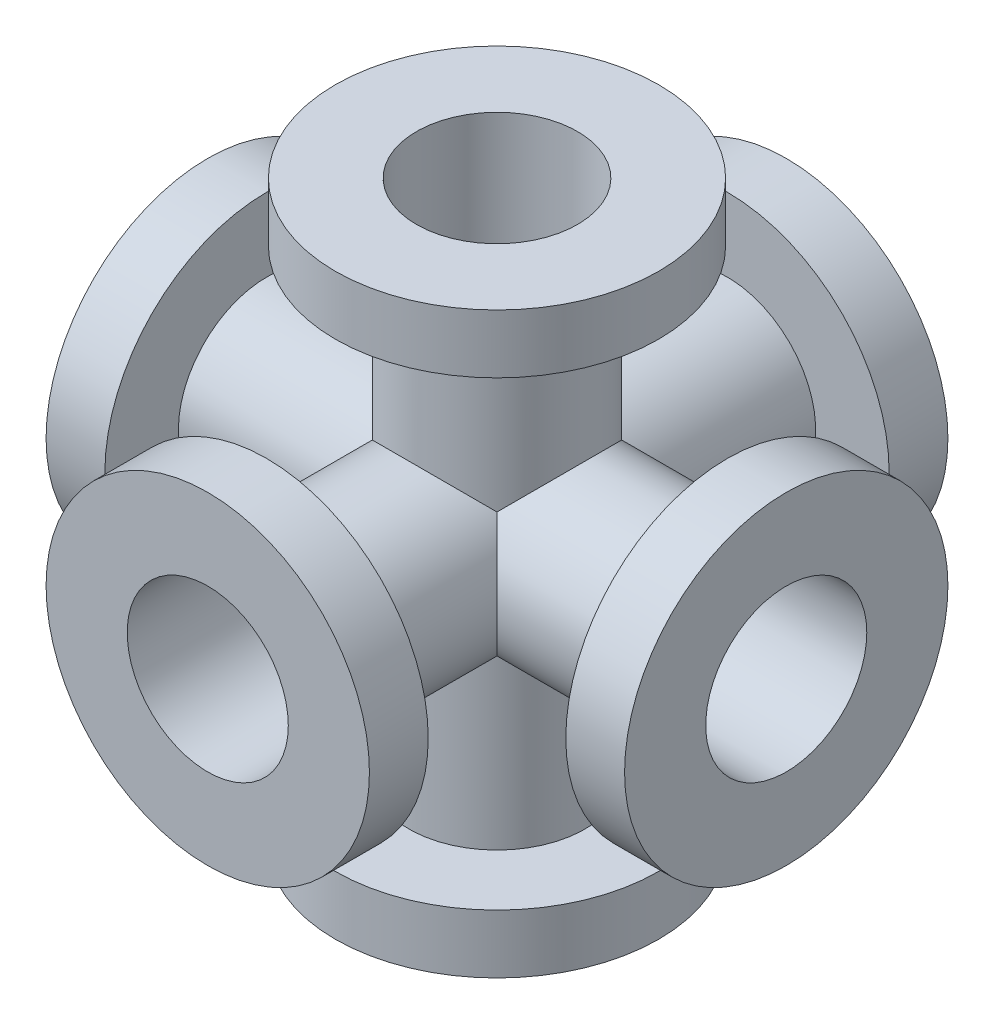
ISO-10303-21;
HEADER;
FILE_DESCRIPTION(('STEP AP214'),'2;1');
FILE_NAME('part.step','',(''),(''),'','','');
FILE_SCHEMA(('AUTOMOTIVE_DESIGN { 1 0 10303 214 1 1 1 1 }'));
ENDSEC;
DATA;
#1=APPLICATION_CONTEXT('core data for automotive mechanical design processes');
#2=APPLICATION_PROTOCOL_DEFINITION('international standard','automotive_design',2000,#1);
#3=PRODUCT_CONTEXT('',#1,'mechanical');
#4=PRODUCT('Part','Part','',(#3));
#5=PRODUCT_RELATED_PRODUCT_CATEGORY('part','',(#4));
#6=PRODUCT_DEFINITION_FORMATION('','',#4);
#7=PRODUCT_DEFINITION_CONTEXT('part definition',#1,'design');
#8=PRODUCT_DEFINITION('design','',#6,#7);
#9=PRODUCT_DEFINITION_SHAPE('','',#8);
#10=(LENGTH_UNIT() NAMED_UNIT(*) SI_UNIT(.MILLI.,.METRE.));
#11=(NAMED_UNIT(*) PLANE_ANGLE_UNIT() SI_UNIT($,.RADIAN.));
#12=(NAMED_UNIT(*) SI_UNIT($,.STERADIAN.) SOLID_ANGLE_UNIT());
#13=UNCERTAINTY_MEASURE_WITH_UNIT(LENGTH_MEASURE(1.E-05),#10,'distance_accuracy_value','');
#14=(GEOMETRIC_REPRESENTATION_CONTEXT(3) GLOBAL_UNCERTAINTY_ASSIGNED_CONTEXT((#13)) GLOBAL_UNIT_ASSIGNED_CONTEXT((#10,
#11,#12)) REPRESENTATION_CONTEXT('',''));
#15=CARTESIAN_POINT('',(0.,0.,0.));
#16=DIRECTION('',(0.,0.,1.));
#17=DIRECTION('',(1.,0.,0.));
#18=AXIS2_PLACEMENT_3D('',#15,#16,#17);
#19=CARTESIAN_POINT('',(0.,-62.484,0.));
#20=DIRECTION('',(0.,1.,0.));
#21=DIRECTION('',(0.,0.,1.));
#22=AXIS2_PLACEMENT_3D('',#19,#20,#21);
#23=CYLINDRICAL_SURFACE('',#22,19.05);
#24=CARTESIAN_POINT('',(0.,0.,0.));
#25=DIRECTION('',(0.707106781186547,0.707106781186547,0.));
#26=DIRECTION('',(-0.707106781186547,0.707106781186547,0.));
#27=AXIS2_PLACEMENT_3D('',#24,#25,#26);
#28=ELLIPSE('',#27,26.9407683632075,19.05);
#29=CARTESIAN_POINT('',(13.4703841816037,-13.4703841816037,13.4703841816037));
#30=VERTEX_POINT('',#29);
#31=CARTESIAN_POINT('',(13.4703841816037,-13.4703841816037,-13.4703841816037));
#32=VERTEX_POINT('',#31);
#33=EDGE_CURVE('E135',#30,#32,#28,.T.);
#34=ORIENTED_EDGE('',*,*,#33,.F.);
#35=CARTESIAN_POINT('',(0.,0.,0.));
#36=DIRECTION('',(0.,0.707106781186547,0.707106781186547));
#37=DIRECTION('',(0.,0.707106781186547,-0.707106781186547));
#38=AXIS2_PLACEMENT_3D('',#35,#36,#37);
#39=ELLIPSE('',#38,26.9407683632075,19.05);
#40=CARTESIAN_POINT('',(-13.4703841816037,-13.4703841816037,13.4703841816037));
#41=VERTEX_POINT('',#40);
#42=EDGE_CURVE('E162',#41,#30,#39,.T.);
#43=ORIENTED_EDGE('',*,*,#42,.F.);
#44=CARTESIAN_POINT('',(0.,0.,0.));
#45=DIRECTION('',(-0.707106781186547,0.707106781186547,0.));
#46=DIRECTION('',(0.707106781186547,0.707106781186547,0.));
#47=AXIS2_PLACEMENT_3D('',#44,#45,#46);
#48=ELLIPSE('',#47,26.9407683632075,19.05);
#49=CARTESIAN_POINT('',(-13.4703841816037,-13.4703841816037,-13.4703841816037));
#50=VERTEX_POINT('',#49);
#51=EDGE_CURVE('E147',#50,#41,#48,.T.);
#52=ORIENTED_EDGE('',*,*,#51,.F.);
#53=CARTESIAN_POINT('',(0.,0.,0.));
#54=DIRECTION('',(0.,0.707106781186547,-0.707106781186547));
#55=DIRECTION('',(0.,0.707106781186547,0.707106781186547));
#56=AXIS2_PLACEMENT_3D('',#53,#54,#55);
#57=ELLIPSE('',#56,26.9407683632075,19.05);
#58=EDGE_CURVE('E159',#32,#50,#57,.T.);
#59=ORIENTED_EDGE('',*,*,#58,.F.);
#60=EDGE_LOOP('',(#34,#43,#52,#59));
#61=FACE_BOUND('',#60,.T.);
#62=CARTESIAN_POINT('',(0.,-49.784,0.));
#63=DIRECTION('',(0.,-1.,0.));
#64=DIRECTION('',(0.,0.,-1.));
#65=AXIS2_PLACEMENT_3D('',#62,#63,#64);
#66=CIRCLE('',#65,19.05);
#67=CARTESIAN_POINT('',(0.,-49.784,-19.05));
#68=VERTEX_POINT('',#67);
#69=EDGE_CURVE('E207',#68,#68,#66,.F.);
#70=ORIENTED_EDGE('',*,*,#69,.T.);
#71=EDGE_LOOP('',(#70));
#72=FACE_BOUND('',#71,.T.);
#73=ADVANCED_FACE('F31',(#61,#72),#23,.T.);
#74=CARTESIAN_POINT('',(0.,0.,0.));
#75=DIRECTION('',(0.707106781186547,0.707106781186547,0.));
#76=DIRECTION('',(-0.707106781186547,0.707106781186547,0.));
#77=AXIS2_PLACEMENT_3D('',#74,#75,#76);
#78=ELLIPSE('',#77,26.9407683632075,19.05);
#79=CARTESIAN_POINT('',(-13.4703841816037,13.4703841816037,13.4703841816037));
#80=VERTEX_POINT('',#79);
#81=CARTESIAN_POINT('',(-13.4703841816037,13.4703841816037,-13.4703841816037));
#82=VERTEX_POINT('',#81);
#83=EDGE_CURVE('E138',#80,#82,#78,.F.);
#84=ORIENTED_EDGE('',*,*,#83,.F.);
#85=CARTESIAN_POINT('',(0.,0.,0.));
#86=DIRECTION('',(0.,0.707106781186547,-0.707106781186547));
#87=DIRECTION('',(0.,0.707106781186547,0.707106781186547));
#88=AXIS2_PLACEMENT_3D('',#85,#86,#87);
#89=ELLIPSE('',#88,26.9407683632075,19.05);
#90=CARTESIAN_POINT('',(13.4703841816037,13.4703841816037,13.4703841816037));
#91=VERTEX_POINT('',#90);
#92=EDGE_CURVE('E156',#91,#80,#89,.F.);
#93=ORIENTED_EDGE('',*,*,#92,.F.);
#94=CARTESIAN_POINT('',(0.,0.,0.));
#95=DIRECTION('',(-0.707106781186547,0.707106781186547,0.));
#96=DIRECTION('',(0.707106781186547,0.707106781186547,0.));
#97=AXIS2_PLACEMENT_3D('',#94,#95,#96);
#98=ELLIPSE('',#97,26.9407683632075,19.05);
#99=CARTESIAN_POINT('',(13.4703841816037,13.4703841816037,-13.4703841816037));
#100=VERTEX_POINT('',#99);
#101=EDGE_CURVE('E126',#100,#91,#98,.F.);
#102=ORIENTED_EDGE('',*,*,#101,.F.);
#103=CARTESIAN_POINT('',(0.,0.,0.));
#104=DIRECTION('',(0.,0.707106781186547,0.707106781186547));
#105=DIRECTION('',(0.,0.707106781186547,-0.707106781186547));
#106=AXIS2_PLACEMENT_3D('',#103,#104,#105);
#107=ELLIPSE('',#106,26.9407683632075,19.05);
#108=EDGE_CURVE('E165',#82,#100,#107,.F.);
#109=ORIENTED_EDGE('',*,*,#108,.F.);
#110=EDGE_LOOP('',(#84,#93,#102,#109));
#111=FACE_BOUND('',#110,.T.);
#112=CARTESIAN_POINT('',(0.,49.784,0.));
#113=DIRECTION('',(0.,1.,0.));
#114=DIRECTION('',(0.,0.,1.));
#115=AXIS2_PLACEMENT_3D('',#112,#113,#114);
#116=CIRCLE('',#115,19.05);
#117=CARTESIAN_POINT('',(0.,49.784,19.05));
#118=VERTEX_POINT('',#117);
#119=EDGE_CURVE('E221',#118,#118,#116,.F.);
#120=ORIENTED_EDGE('',*,*,#119,.T.);
#121=EDGE_LOOP('',(#120));
#122=FACE_BOUND('',#121,.T.);
#123=ADVANCED_FACE('F195',(#111,#122),#23,.T.);
#124=CARTESIAN_POINT('',(0.,0.,-62.484));
#125=DIRECTION('',(0.,0.,1.));
#126=DIRECTION('',(1.,0.,0.));
#127=AXIS2_PLACEMENT_3D('',#124,#125,#126);
#128=CYLINDRICAL_SURFACE('',#127,19.05);
#129=CARTESIAN_POINT('',(0.,0.,0.));
#130=DIRECTION('',(0.707106781186547,0.,0.707106781186547));
#131=DIRECTION('',(-0.707106781186547,0.,0.707106781186547));
#132=AXIS2_PLACEMENT_3D('',#129,#130,#131);
#133=ELLIPSE('',#132,26.9407683632075,19.05);
#134=EDGE_CURVE('E141',#41,#80,#133,.F.);
#135=ORIENTED_EDGE('',*,*,#134,.F.);
#136=ORIENTED_EDGE('',*,*,#42,.T.);
#137=CARTESIAN_POINT('',(0.,0.,0.));
#138=DIRECTION('',(-0.707106781186547,0.,0.707106781186547));
#139=DIRECTION('',(0.707106781186547,0.,0.707106781186547));
#140=AXIS2_PLACEMENT_3D('',#137,#138,#139);
#141=ELLIPSE('',#140,26.9407683632075,19.05);
#142=EDGE_CURVE('E129',#91,#30,#141,.F.);
#143=ORIENTED_EDGE('',*,*,#142,.F.);
#144=ORIENTED_EDGE('',*,*,#92,.T.);
#145=EDGE_LOOP('',(#135,#136,#143,#144));
#146=FACE_BOUND('',#145,.T.);
#147=CARTESIAN_POINT('',(0.,0.,49.784));
#148=DIRECTION('',(0.,0.,1.));
#149=DIRECTION('',(1.,0.,0.));
#150=AXIS2_PLACEMENT_3D('',#147,#148,#149);
#151=CIRCLE('',#150,19.05);
#152=CARTESIAN_POINT('',(19.05,0.,49.784));
#153=VERTEX_POINT('',#152);
#154=EDGE_CURVE('E229',#153,#153,#151,.F.);
#155=ORIENTED_EDGE('',*,*,#154,.T.);
#156=EDGE_LOOP('',(#155));
#157=FACE_BOUND('',#156,.T.);
#158=ADVANCED_FACE('F200',(#146,#157),#128,.T.);
#159=CARTESIAN_POINT('',(0.,0.,0.));
#160=DIRECTION('',(0.707106781186547,0.,0.707106781186547));
#161=DIRECTION('',(-0.707106781186547,0.,0.707106781186547));
#162=AXIS2_PLACEMENT_3D('',#159,#160,#161);
#163=ELLIPSE('',#162,26.9407683632075,19.05);
#164=EDGE_CURVE('E132',#32,#100,#163,.T.);
#165=ORIENTED_EDGE('',*,*,#164,.F.);
#166=ORIENTED_EDGE('',*,*,#58,.T.);
#167=CARTESIAN_POINT('',(0.,0.,0.));
#168=DIRECTION('',(-0.707106781186547,0.,0.707106781186547));
#169=DIRECTION('',(0.707106781186547,0.,0.707106781186547));
#170=AXIS2_PLACEMENT_3D('',#167,#168,#169);
#171=ELLIPSE('',#170,26.9407683632075,19.05);
#172=EDGE_CURVE('E144',#82,#50,#171,.T.);
#173=ORIENTED_EDGE('',*,*,#172,.F.);
#174=ORIENTED_EDGE('',*,*,#108,.T.);
#175=EDGE_LOOP('',(#165,#166,#173,#174));
#176=FACE_BOUND('',#175,.T.);
#177=CARTESIAN_POINT('',(0.,0.,-49.784));
#178=DIRECTION('',(0.,0.,-1.));
#179=DIRECTION('',(-1.,0.,0.));
#180=AXIS2_PLACEMENT_3D('',#177,#178,#179);
#181=CIRCLE('',#180,19.05);
#182=CARTESIAN_POINT('',(-19.05,0.,-49.784));
#183=VERTEX_POINT('',#182);
#184=EDGE_CURVE('E238',#183,#183,#181,.F.);
#185=ORIENTED_EDGE('',*,*,#184,.T.);
#186=EDGE_LOOP('',(#185));
#187=FACE_BOUND('',#186,.T.);
#188=ADVANCED_FACE('F328',(#176,#187),#128,.T.);
#189=CARTESIAN_POINT('',(-62.484,0.,0.));
#190=DIRECTION('',(1.,0.,0.));
#191=DIRECTION('',(0.,0.,-1.));
#192=AXIS2_PLACEMENT_3D('',#189,#190,#191);
#193=CYLINDRICAL_SURFACE('',#192,19.05);
#194=ORIENTED_EDGE('',*,*,#172,.T.);
#195=ORIENTED_EDGE('',*,*,#51,.T.);
#196=ORIENTED_EDGE('',*,*,#134,.T.);
#197=ORIENTED_EDGE('',*,*,#83,.T.);
#198=EDGE_LOOP('',(#194,#195,#196,#197));
#199=FACE_BOUND('',#198,.T.);
#200=CARTESIAN_POINT('',(-49.784,0.,0.));
#201=DIRECTION('',(-1.,0.,0.));
#202=DIRECTION('',(0.,0.,1.));
#203=AXIS2_PLACEMENT_3D('',#200,#201,#202);
#204=CIRCLE('',#203,19.05);
#205=CARTESIAN_POINT('',(-49.784,0.,19.05));
#206=VERTEX_POINT('',#205);
#207=EDGE_CURVE('E247',#206,#206,#204,.F.);
#208=ORIENTED_EDGE('',*,*,#207,.T.);
#209=EDGE_LOOP('',(#208));
#210=FACE_BOUND('',#209,.T.);
#211=ADVANCED_FACE('F325',(#199,#210),#193,.T.);
#212=ORIENTED_EDGE('',*,*,#142,.T.);
#213=ORIENTED_EDGE('',*,*,#33,.T.);
#214=ORIENTED_EDGE('',*,*,#164,.T.);
#215=ORIENTED_EDGE('',*,*,#101,.T.);
#216=EDGE_LOOP('',(#212,#213,#214,#215));
#217=FACE_BOUND('',#216,.T.);
#218=CARTESIAN_POINT('',(49.784,0.,0.));
#219=DIRECTION('',(1.,0.,0.));
#220=DIRECTION('',(0.,0.,-1.));
#221=AXIS2_PLACEMENT_3D('',#218,#219,#220);
#222=CIRCLE('',#221,19.05);
#223=CARTESIAN_POINT('',(49.784,0.,-19.05));
#224=VERTEX_POINT('',#223);
#225=EDGE_CURVE('E34',#224,#224,#222,.F.);
#226=ORIENTED_EDGE('',*,*,#225,.T.);
#227=EDGE_LOOP('',(#226));
#228=FACE_BOUND('',#227,.T.);
#229=ADVANCED_FACE('F327',(#217,#228),#193,.T.);
#230=CARTESIAN_POINT('',(-62.484,0.,0.));
#231=DIRECTION('',(1.,0.,0.));
#232=DIRECTION('',(0.,0.,-1.));
#233=AXIS2_PLACEMENT_3D('',#230,#231,#232);
#234=CYLINDRICAL_SURFACE('',#233,17.399);
#235=CARTESIAN_POINT('',(62.484,0.,0.));
#236=DIRECTION('',(1.,0.,0.));
#237=DIRECTION('',(0.,0.,-1.));
#238=AXIS2_PLACEMENT_3D('',#235,#236,#237);
#239=CIRCLE('',#238,17.399);
#240=CARTESIAN_POINT('',(62.484,0.,-17.399));
#241=VERTEX_POINT('',#240);
#242=EDGE_CURVE('E115',#241,#241,#239,.T.);
#243=ORIENTED_EDGE('',*,*,#242,.T.);
#244=EDGE_LOOP('',(#243));
#245=FACE_BOUND('',#244,.T.);
#246=CARTESIAN_POINT('',(0.,0.,0.));
#247=DIRECTION('',(0.707106781186547,0.,0.707106781186547));
#248=DIRECTION('',(0.707106781186547,0.,-0.707106781186547));
#249=AXIS2_PLACEMENT_3D('',#246,#247,#248);
#250=ELLIPSE('',#249,24.6059017717295,17.399);
#251=CARTESIAN_POINT('',(12.3029508858647,12.3029508858647,-12.3029508858647));
#252=VERTEX_POINT('',#251);
#253=CARTESIAN_POINT('',(12.3029508858647,-12.3029508858647,-12.3029508858647));
#254=VERTEX_POINT('',#253);
#255=EDGE_CURVE('E117',#252,#254,#250,.F.);
#256=ORIENTED_EDGE('',*,*,#255,.T.);
#257=CARTESIAN_POINT('',(0.,0.,0.));
#258=DIRECTION('',(0.707106781186547,0.707106781186547,0.));
#259=DIRECTION('',(0.707106781186547,-0.707106781186547,0.));
#260=AXIS2_PLACEMENT_3D('',#257,#258,#259);
#261=ELLIPSE('',#260,24.6059017717295,17.399);
#262=CARTESIAN_POINT('',(12.3029508858647,-12.3029508858647,12.3029508858647));
#263=VERTEX_POINT('',#262);
#264=EDGE_CURVE('E53',#254,#263,#261,.F.);
#265=ORIENTED_EDGE('',*,*,#264,.T.);
#266=CARTESIAN_POINT('',(0.,0.,0.));
#267=DIRECTION('',(0.707106781186547,0.,-0.707106781186547));
#268=DIRECTION('',(0.707106781186547,0.,0.707106781186547));
#269=AXIS2_PLACEMENT_3D('',#266,#267,#268);
#270=ELLIPSE('',#269,24.6059017717295,17.399);
#271=CARTESIAN_POINT('',(12.3029508858647,12.3029508858647,12.3029508858647));
#272=VERTEX_POINT('',#271);
#273=EDGE_CURVE('E112',#263,#272,#270,.F.);
#274=ORIENTED_EDGE('',*,*,#273,.T.);
#275=CARTESIAN_POINT('',(0.,0.,0.));
#276=DIRECTION('',(0.707106781186547,-0.707106781186547,0.));
#277=DIRECTION('',(0.707106781186547,0.707106781186547,0.));
#278=AXIS2_PLACEMENT_3D('',#275,#276,#277);
#279=ELLIPSE('',#278,24.6059017717295,17.399);
#280=EDGE_CURVE('E264',#272,#252,#279,.F.);
#281=ORIENTED_EDGE('',*,*,#280,.T.);
#282=EDGE_LOOP('',(#256,#265,#274,#281));
#283=FACE_BOUND('',#282,.T.);
#284=ADVANCED_FACE('F188',(#245,#283),#234,.F.);
#285=CARTESIAN_POINT('',(0.,-62.484,0.));
#286=DIRECTION('',(0.,1.,0.));
#287=DIRECTION('',(0.,0.,1.));
#288=AXIS2_PLACEMENT_3D('',#285,#286,#287);
#289=PLANE('',#288);
#290=CARTESIAN_POINT('',(0.,-62.484,0.));
#291=DIRECTION('',(0.,1.,0.));
#292=DIRECTION('',(0.,0.,1.));
#293=AXIS2_PLACEMENT_3D('',#290,#291,#292);
#294=CIRCLE('',#293,17.399);
#295=CARTESIAN_POINT('',(0.,-62.484,17.399));
#296=VERTEX_POINT('',#295);
#297=EDGE_CURVE('E100',#296,#296,#294,.T.);
#298=ORIENTED_EDGE('',*,*,#297,.T.);
#299=EDGE_LOOP('',(#298));
#300=FACE_BOUND('',#299,.T.);
#301=CARTESIAN_POINT('',(0.,-62.484,0.));
#302=DIRECTION('',(0.,1.,0.));
#303=DIRECTION('',(0.,0.,1.));
#304=AXIS2_PLACEMENT_3D('',#301,#302,#303);
#305=CIRCLE('',#304,34.925);
#306=CARTESIAN_POINT('',(0.,-62.484,34.925));
#307=VERTEX_POINT('',#306);
#308=EDGE_CURVE('E216',#307,#307,#305,.T.);
#309=ORIENTED_EDGE('',*,*,#308,.F.);
#310=EDGE_LOOP('',(#309));
#311=FACE_BOUND('',#310,.T.);
#312=ADVANCED_FACE('F174',(#300,#311),#289,.F.);
#313=CARTESIAN_POINT('',(0.,-62.484,0.));
#314=DIRECTION('',(0.,1.,0.));
#315=DIRECTION('',(0.,0.,1.));
#316=AXIS2_PLACEMENT_3D('',#313,#314,#315);
#317=CYLINDRICAL_SURFACE('',#316,17.399);
#318=ORIENTED_EDGE('',*,*,#297,.F.);
#319=EDGE_LOOP('',(#318));
#320=FACE_BOUND('',#319,.T.);
#321=CARTESIAN_POINT('',(0.,0.,0.));
#322=DIRECTION('',(0.,-0.707106781186547,0.707106781186547));
#323=DIRECTION('',(0.,0.707106781186547,0.707106781186547));
#324=AXIS2_PLACEMENT_3D('',#321,#322,#323);
#325=ELLIPSE('',#324,24.6059017717295,17.399);
#326=CARTESIAN_POINT('',(-12.3029508858647,-12.3029508858647,-12.3029508858647));
#327=VERTEX_POINT('',#326);
#328=EDGE_CURVE('E39',#327,#254,#325,.T.);
#329=ORIENTED_EDGE('',*,*,#328,.F.);
#330=CARTESIAN_POINT('',(0.,0.,0.));
#331=DIRECTION('',(0.707106781186547,-0.707106781186547,0.));
#332=DIRECTION('',(0.707106781186547,0.707106781186547,0.));
#333=AXIS2_PLACEMENT_3D('',#330,#331,#332);
#334=ELLIPSE('',#333,24.6059017717295,17.399);
#335=CARTESIAN_POINT('',(-12.3029508858647,-12.3029508858647,12.3029508858647));
#336=VERTEX_POINT('',#335);
#337=EDGE_CURVE('E94',#336,#327,#334,.T.);
#338=ORIENTED_EDGE('',*,*,#337,.F.);
#339=CARTESIAN_POINT('',(0.,0.,0.));
#340=DIRECTION('',(0.,0.707106781186547,0.707106781186547));
#341=DIRECTION('',(0.,-0.707106781186547,0.707106781186547));
#342=AXIS2_PLACEMENT_3D('',#339,#340,#341);
#343=ELLIPSE('',#342,24.6059017717295,17.399);
#344=EDGE_CURVE('E109',#263,#336,#343,.F.);
#345=ORIENTED_EDGE('',*,*,#344,.F.);
#346=ORIENTED_EDGE('',*,*,#264,.F.);
#347=EDGE_LOOP('',(#329,#338,#345,#346));
#348=FACE_BOUND('',#347,.T.);
#349=ADVANCED_FACE('F93',(#320,#348),#317,.F.);
#350=CARTESIAN_POINT('',(0.,0.,-62.484));
#351=DIRECTION('',(0.,0.,1.));
#352=DIRECTION('',(1.,0.,0.));
#353=AXIS2_PLACEMENT_3D('',#350,#351,#352);
#354=PLANE('',#353);
#355=CARTESIAN_POINT('',(0.,0.,-62.484));
#356=DIRECTION('',(0.,0.,1.));
#357=DIRECTION('',(1.,0.,0.));
#358=AXIS2_PLACEMENT_3D('',#355,#356,#357);
#359=CIRCLE('',#358,17.399);
#360=CARTESIAN_POINT('',(17.399,0.,-62.484));
#361=VERTEX_POINT('',#360);
#362=EDGE_CURVE('E153',#361,#361,#359,.T.);
#363=ORIENTED_EDGE('',*,*,#362,.T.);
#364=EDGE_LOOP('',(#363));
#365=FACE_BOUND('',#364,.T.);
#366=CARTESIAN_POINT('',(0.,0.,-62.484));
#367=DIRECTION('',(0.,0.,-1.));
#368=DIRECTION('',(-1.,0.,0.));
#369=AXIS2_PLACEMENT_3D('',#366,#367,#368);
#370=CIRCLE('',#369,34.925);
#371=CARTESIAN_POINT('',(-34.925,0.,-62.484));
#372=VERTEX_POINT('',#371);
#373=EDGE_CURVE('E234',#372,#372,#370,.T.);
#374=ORIENTED_EDGE('',*,*,#373,.T.);
#375=EDGE_LOOP('',(#374));
#376=FACE_BOUND('',#375,.T.);
#377=ADVANCED_FACE('F178',(#365,#376),#354,.F.);
#378=CARTESIAN_POINT('',(0.,0.,-62.484));
#379=DIRECTION('',(0.,0.,1.));
#380=DIRECTION('',(1.,0.,0.));
#381=AXIS2_PLACEMENT_3D('',#378,#379,#380);
#382=CYLINDRICAL_SURFACE('',#381,17.399);
#383=CARTESIAN_POINT('',(0.,0.,62.484));
#384=DIRECTION('',(0.,0.,1.));
#385=DIRECTION('',(1.,0.,0.));
#386=AXIS2_PLACEMENT_3D('',#383,#384,#385);
#387=CIRCLE('',#386,17.399);
#388=CARTESIAN_POINT('',(17.399,0.,62.484));
#389=VERTEX_POINT('',#388);
#390=EDGE_CURVE('E150',#389,#389,#387,.T.);
#391=ORIENTED_EDGE('',*,*,#390,.T.);
#392=EDGE_LOOP('',(#391));
#393=FACE_BOUND('',#392,.T.);
#394=ORIENTED_EDGE('',*,*,#273,.F.);
#395=ORIENTED_EDGE('',*,*,#344,.T.);
#396=CARTESIAN_POINT('',(0.,0.,0.));
#397=DIRECTION('',(0.707106781186547,0.,0.707106781186547));
#398=DIRECTION('',(0.707106781186547,0.,-0.707106781186547));
#399=AXIS2_PLACEMENT_3D('',#396,#397,#398);
#400=ELLIPSE('',#399,24.6059017717295,17.399);
#401=CARTESIAN_POINT('',(-12.3029508858647,12.3029508858647,12.3029508858647));
#402=VERTEX_POINT('',#401);
#403=EDGE_CURVE('E108',#402,#336,#400,.T.);
#404=ORIENTED_EDGE('',*,*,#403,.F.);
#405=CARTESIAN_POINT('',(0.,0.,0.));
#406=DIRECTION('',(0.,-0.707106781186547,0.707106781186547));
#407=DIRECTION('',(0.,0.707106781186547,0.707106781186547));
#408=AXIS2_PLACEMENT_3D('',#405,#406,#407);
#409=ELLIPSE('',#408,24.6059017717295,17.399);
#410=EDGE_CURVE('E261',#402,#272,#409,.F.);
#411=ORIENTED_EDGE('',*,*,#410,.T.);
#412=EDGE_LOOP('',(#394,#395,#404,#411));
#413=FACE_BOUND('',#412,.T.);
#414=ADVANCED_FACE('F185',(#393,#413),#382,.F.);
#415=CARTESIAN_POINT('',(0.,0.,62.484));
#416=DIRECTION('',(0.,0.,1.));
#417=DIRECTION('',(1.,0.,0.));
#418=AXIS2_PLACEMENT_3D('',#415,#416,#417);
#419=PLANE('',#418);
#420=ORIENTED_EDGE('',*,*,#390,.F.);
#421=EDGE_LOOP('',(#420));
#422=FACE_BOUND('',#421,.T.);
#423=CARTESIAN_POINT('',(0.,0.,62.484));
#424=DIRECTION('',(0.,0.,-1.));
#425=DIRECTION('',(-1.,0.,0.));
#426=AXIS2_PLACEMENT_3D('',#423,#424,#425);
#427=CIRCLE('',#426,34.925);
#428=CARTESIAN_POINT('',(-34.925,0.,62.484));
#429=VERTEX_POINT('',#428);
#430=EDGE_CURVE('E225',#429,#429,#427,.T.);
#431=ORIENTED_EDGE('',*,*,#430,.F.);
#432=EDGE_LOOP('',(#431));
#433=FACE_BOUND('',#432,.T.);
#434=ADVANCED_FACE('F270',(#422,#433),#419,.T.);
#435=CARTESIAN_POINT('',(0.,62.484,0.));
#436=DIRECTION('',(0.,1.,0.));
#437=DIRECTION('',(0.,0.,1.));
#438=AXIS2_PLACEMENT_3D('',#435,#436,#437);
#439=PLANE('',#438);
#440=CARTESIAN_POINT('',(0.,62.484,0.));
#441=DIRECTION('',(0.,1.,0.));
#442=DIRECTION('',(0.,0.,1.));
#443=AXIS2_PLACEMENT_3D('',#440,#441,#442);
#444=CIRCLE('',#443,17.399);
#445=CARTESIAN_POINT('',(0.,62.484,17.399));
#446=VERTEX_POINT('',#445);
#447=EDGE_CURVE('E168',#446,#446,#444,.T.);
#448=ORIENTED_EDGE('',*,*,#447,.F.);
#449=EDGE_LOOP('',(#448));
#450=FACE_BOUND('',#449,.T.);
#451=CARTESIAN_POINT('',(0.,62.484,0.));
#452=DIRECTION('',(0.,1.,0.));
#453=DIRECTION('',(0.,0.,1.));
#454=AXIS2_PLACEMENT_3D('',#451,#452,#453);
#455=CIRCLE('',#454,34.925);
#456=CARTESIAN_POINT('',(0.,62.484,34.925));
#457=VERTEX_POINT('',#456);
#458=EDGE_CURVE('E209',#457,#457,#455,.T.);
#459=ORIENTED_EDGE('',*,*,#458,.T.);
#460=EDGE_LOOP('',(#459));
#461=FACE_BOUND('',#460,.T.);
#462=ADVANCED_FACE('F192',(#450,#461),#439,.T.);
#463=ORIENTED_EDGE('',*,*,#447,.T.);
#464=EDGE_LOOP('',(#463));
#465=FACE_BOUND('',#464,.T.);
#466=ORIENTED_EDGE('',*,*,#410,.F.);
#467=CARTESIAN_POINT('',(0.,0.,0.));
#468=DIRECTION('',(0.707106781186547,0.707106781186547,0.));
#469=DIRECTION('',(0.707106781186547,-0.707106781186547,0.));
#470=AXIS2_PLACEMENT_3D('',#467,#468,#469);
#471=ELLIPSE('',#470,24.6059017717295,17.399);
#472=CARTESIAN_POINT('',(-12.3029508858647,12.3029508858647,-12.3029508858647));
#473=VERTEX_POINT('',#472);
#474=EDGE_CURVE('E46',#473,#402,#471,.T.);
#475=ORIENTED_EDGE('',*,*,#474,.F.);
#476=CARTESIAN_POINT('',(0.,0.,0.));
#477=DIRECTION('',(0.,0.707106781186547,0.707106781186547));
#478=DIRECTION('',(0.,-0.707106781186547,0.707106781186547));
#479=AXIS2_PLACEMENT_3D('',#476,#477,#478);
#480=ELLIPSE('',#479,24.6059017717295,17.399);
#481=EDGE_CURVE('E11',#252,#473,#480,.T.);
#482=ORIENTED_EDGE('',*,*,#481,.F.);
#483=ORIENTED_EDGE('',*,*,#280,.F.);
#484=EDGE_LOOP('',(#466,#475,#482,#483));
#485=FACE_BOUND('',#484,.T.);
#486=ADVANCED_FACE('F180',(#465,#485),#317,.F.);
#487=CARTESIAN_POINT('',(62.484,0.,0.));
#488=DIRECTION('',(1.,0.,0.));
#489=DIRECTION('',(0.,0.,-1.));
#490=AXIS2_PLACEMENT_3D('',#487,#488,#489);
#491=PLANE('',#490);
#492=ORIENTED_EDGE('',*,*,#242,.F.);
#493=EDGE_LOOP('',(#492));
#494=FACE_BOUND('',#493,.T.);
#495=CARTESIAN_POINT('',(62.484,0.,0.));
#496=DIRECTION('',(1.,0.,0.));
#497=DIRECTION('',(0.,0.,-1.));
#498=AXIS2_PLACEMENT_3D('',#495,#496,#497);
#499=CIRCLE('',#498,34.925);
#500=CARTESIAN_POINT('',(62.484,0.,-34.925));
#501=VERTEX_POINT('',#500);
#502=EDGE_CURVE('E252',#501,#501,#499,.T.);
#503=ORIENTED_EDGE('',*,*,#502,.T.);
#504=EDGE_LOOP('',(#503));
#505=FACE_BOUND('',#504,.T.);
#506=ADVANCED_FACE('F191',(#494,#505),#491,.T.);
#507=CARTESIAN_POINT('',(-62.484,0.,0.));
#508=DIRECTION('',(1.,0.,0.));
#509=DIRECTION('',(0.,0.,-1.));
#510=AXIS2_PLACEMENT_3D('',#507,#508,#509);
#511=PLANE('',#510);
#512=CARTESIAN_POINT('',(-62.484,0.,0.));
#513=DIRECTION('',(1.,0.,0.));
#514=DIRECTION('',(0.,0.,-1.));
#515=AXIS2_PLACEMENT_3D('',#512,#513,#514);
#516=CIRCLE('',#515,17.399);
#517=CARTESIAN_POINT('',(-62.484,0.,-17.399));
#518=VERTEX_POINT('',#517);
#519=EDGE_CURVE('E123',#518,#518,#516,.T.);
#520=ORIENTED_EDGE('',*,*,#519,.T.);
#521=EDGE_LOOP('',(#520));
#522=FACE_BOUND('',#521,.T.);
#523=CARTESIAN_POINT('',(-62.484,0.,0.));
#524=DIRECTION('',(1.,0.,0.));
#525=DIRECTION('',(0.,0.,-1.));
#526=AXIS2_PLACEMENT_3D('',#523,#524,#525);
#527=CIRCLE('',#526,34.925);
#528=CARTESIAN_POINT('',(-62.484,0.,-34.925));
#529=VERTEX_POINT('',#528);
#530=EDGE_CURVE('E243',#529,#529,#527,.T.);
#531=ORIENTED_EDGE('',*,*,#530,.F.);
#532=EDGE_LOOP('',(#531));
#533=FACE_BOUND('',#532,.T.);
#534=ADVANCED_FACE('F288',(#522,#533),#511,.F.);
#535=ORIENTED_EDGE('',*,*,#519,.F.);
#536=EDGE_LOOP('',(#535));
#537=FACE_BOUND('',#536,.T.);
#538=CARTESIAN_POINT('',(0.,0.,0.));
#539=DIRECTION('',(0.707106781186547,0.,-0.707106781186547));
#540=DIRECTION('',(0.707106781186547,0.,0.707106781186547));
#541=AXIS2_PLACEMENT_3D('',#538,#539,#540);
#542=ELLIPSE('',#541,24.6059017717295,17.399);
#543=EDGE_CURVE('E106',#327,#473,#542,.T.);
#544=ORIENTED_EDGE('',*,*,#543,.T.);
#545=ORIENTED_EDGE('',*,*,#474,.T.);
#546=ORIENTED_EDGE('',*,*,#403,.T.);
#547=ORIENTED_EDGE('',*,*,#337,.T.);
#548=EDGE_LOOP('',(#544,#545,#546,#547));
#549=FACE_BOUND('',#548,.T.);
#550=ADVANCED_FACE('F105',(#537,#549),#234,.F.);
#551=ORIENTED_EDGE('',*,*,#362,.F.);
#552=EDGE_LOOP('',(#551));
#553=FACE_BOUND('',#552,.T.);
#554=ORIENTED_EDGE('',*,*,#255,.F.);
#555=ORIENTED_EDGE('',*,*,#481,.T.);
#556=ORIENTED_EDGE('',*,*,#543,.F.);
#557=ORIENTED_EDGE('',*,*,#328,.T.);
#558=EDGE_LOOP('',(#554,#555,#556,#557));
#559=FACE_BOUND('',#558,.T.);
#560=ADVANCED_FACE('F111',(#553,#559),#382,.F.);
#561=CARTESIAN_POINT('',(49.784,0.,0.));
#562=DIRECTION('',(1.,0.,0.));
#563=DIRECTION('',(0.,0.,-1.));
#564=AXIS2_PLACEMENT_3D('',#561,#562,#563);
#565=CYLINDRICAL_SURFACE('',#564,34.925);
#566=CARTESIAN_POINT('',(49.784,0.,0.));
#567=DIRECTION('',(1.,0.,0.));
#568=DIRECTION('',(0.,0.,-1.));
#569=AXIS2_PLACEMENT_3D('',#566,#567,#568);
#570=CIRCLE('',#569,34.925);
#571=CARTESIAN_POINT('',(49.784,0.,-34.925));
#572=VERTEX_POINT('',#571);
#573=EDGE_CURVE('E253',#572,#572,#570,.T.);
#574=ORIENTED_EDGE('',*,*,#573,.T.);
#575=EDGE_LOOP('',(#574));
#576=FACE_BOUND('',#575,.T.);
#577=ORIENTED_EDGE('',*,*,#502,.F.);
#578=EDGE_LOOP('',(#577));
#579=FACE_BOUND('',#578,.T.);
#580=ADVANCED_FACE('F279',(#576,#579),#565,.T.);
#581=CARTESIAN_POINT('',(49.784,0.,0.));
#582=DIRECTION('',(1.,0.,0.));
#583=DIRECTION('',(0.,0.,-1.));
#584=AXIS2_PLACEMENT_3D('',#581,#582,#583);
#585=PLANE('',#584);
#586=ORIENTED_EDGE('',*,*,#225,.F.);
#587=EDGE_LOOP('',(#586));
#588=FACE_BOUND('',#587,.T.);
#589=ORIENTED_EDGE('',*,*,#573,.F.);
#590=EDGE_LOOP('',(#589));
#591=FACE_BOUND('',#590,.T.);
#592=ADVANCED_FACE('F285',(#588,#591),#585,.F.);
#593=CARTESIAN_POINT('',(-49.784,0.,0.));
#594=DIRECTION('',(-1.,0.,0.));
#595=DIRECTION('',(0.,0.,-1.));
#596=AXIS2_PLACEMENT_3D('',#593,#594,#595);
#597=PLANE('',#596);
#598=ORIENTED_EDGE('',*,*,#207,.F.);
#599=EDGE_LOOP('',(#598));
#600=FACE_BOUND('',#599,.T.);
#601=CARTESIAN_POINT('',(-49.784,0.,0.));
#602=DIRECTION('',(1.,0.,0.));
#603=DIRECTION('',(0.,0.,-1.));
#604=AXIS2_PLACEMENT_3D('',#601,#602,#603);
#605=CIRCLE('',#604,34.925);
#606=CARTESIAN_POINT('',(-49.784,0.,-34.925));
#607=VERTEX_POINT('',#606);
#608=EDGE_CURVE('E244',#607,#607,#605,.T.);
#609=ORIENTED_EDGE('',*,*,#608,.T.);
#610=EDGE_LOOP('',(#609));
#611=FACE_BOUND('',#610,.T.);
#612=ADVANCED_FACE('F308',(#600,#611),#597,.F.);
#613=CARTESIAN_POINT('',(-49.784,0.,0.));
#614=DIRECTION('',(-1.,0.,0.));
#615=DIRECTION('',(0.,0.,1.));
#616=AXIS2_PLACEMENT_3D('',#613,#614,#615);
#617=CYLINDRICAL_SURFACE('',#616,34.925);
#618=ORIENTED_EDGE('',*,*,#608,.F.);
#619=EDGE_LOOP('',(#618));
#620=FACE_BOUND('',#619,.T.);
#621=ORIENTED_EDGE('',*,*,#530,.T.);
#622=EDGE_LOOP('',(#621));
#623=FACE_BOUND('',#622,.T.);
#624=ADVANCED_FACE('F298',(#620,#623),#617,.T.);
#625=CARTESIAN_POINT('',(0.,0.,-49.784));
#626=DIRECTION('',(0.,0.,-1.));
#627=DIRECTION('',(-1.,0.,0.));
#628=AXIS2_PLACEMENT_3D('',#625,#626,#627);
#629=CYLINDRICAL_SURFACE('',#628,34.925);
#630=CARTESIAN_POINT('',(0.,0.,-49.784));
#631=DIRECTION('',(0.,0.,-1.));
#632=DIRECTION('',(-1.,0.,0.));
#633=AXIS2_PLACEMENT_3D('',#630,#631,#632);
#634=CIRCLE('',#633,34.925);
#635=CARTESIAN_POINT('',(-34.925,0.,-49.784));
#636=VERTEX_POINT('',#635);
#637=EDGE_CURVE('E235',#636,#636,#634,.T.);
#638=ORIENTED_EDGE('',*,*,#637,.T.);
#639=EDGE_LOOP('',(#638));
#640=FACE_BOUND('',#639,.T.);
#641=ORIENTED_EDGE('',*,*,#373,.F.);
#642=EDGE_LOOP('',(#641));
#643=FACE_BOUND('',#642,.T.);
#644=ADVANCED_FACE('F295',(#640,#643),#629,.T.);
#645=CARTESIAN_POINT('',(0.,0.,-49.784));
#646=DIRECTION('',(0.,0.,-1.));
#647=DIRECTION('',(-1.,0.,0.));
#648=AXIS2_PLACEMENT_3D('',#645,#646,#647);
#649=PLANE('',#648);
#650=ORIENTED_EDGE('',*,*,#184,.F.);
#651=EDGE_LOOP('',(#650));
#652=FACE_BOUND('',#651,.T.);
#653=ORIENTED_EDGE('',*,*,#637,.F.);
#654=EDGE_LOOP('',(#653));
#655=FACE_BOUND('',#654,.T.);
#656=ADVANCED_FACE('F297',(#652,#655),#649,.F.);
#657=CARTESIAN_POINT('',(0.,0.,49.784));
#658=DIRECTION('',(0.,0.,1.));
#659=DIRECTION('',(-1.,0.,0.));
#660=AXIS2_PLACEMENT_3D('',#657,#658,#659);
#661=PLANE('',#660);
#662=ORIENTED_EDGE('',*,*,#154,.F.);
#663=EDGE_LOOP('',(#662));
#664=FACE_BOUND('',#663,.T.);
#665=CARTESIAN_POINT('',(0.,0.,49.784));
#666=DIRECTION('',(0.,0.,-1.));
#667=DIRECTION('',(-1.,0.,0.));
#668=AXIS2_PLACEMENT_3D('',#665,#666,#667);
#669=CIRCLE('',#668,34.925);
#670=CARTESIAN_POINT('',(-34.925,0.,49.784));
#671=VERTEX_POINT('',#670);
#672=EDGE_CURVE('E226',#671,#671,#669,.T.);
#673=ORIENTED_EDGE('',*,*,#672,.T.);
#674=EDGE_LOOP('',(#673));
#675=FACE_BOUND('',#674,.T.);
#676=ADVANCED_FACE('F305',(#664,#675),#661,.F.);
#677=CARTESIAN_POINT('',(0.,0.,49.784));
#678=DIRECTION('',(0.,0.,1.));
#679=DIRECTION('',(1.,0.,0.));
#680=AXIS2_PLACEMENT_3D('',#677,#678,#679);
#681=CYLINDRICAL_SURFACE('',#680,34.925);
#682=ORIENTED_EDGE('',*,*,#672,.F.);
#683=EDGE_LOOP('',(#682));
#684=FACE_BOUND('',#683,.T.);
#685=ORIENTED_EDGE('',*,*,#430,.T.);
#686=EDGE_LOOP('',(#685));
#687=FACE_BOUND('',#686,.T.);
#688=ADVANCED_FACE('F363',(#684,#687),#681,.T.);
#689=CARTESIAN_POINT('',(0.,49.784,0.));
#690=DIRECTION('',(0.,1.,0.));
#691=DIRECTION('',(0.,0.,1.));
#692=AXIS2_PLACEMENT_3D('',#689,#690,#691);
#693=CYLINDRICAL_SURFACE('',#692,34.925);
#694=CARTESIAN_POINT('',(0.,49.784,0.));
#695=DIRECTION('',(0.,1.,0.));
#696=DIRECTION('',(0.,0.,1.));
#697=AXIS2_PLACEMENT_3D('',#694,#695,#696);
#698=CIRCLE('',#697,34.925);
#699=CARTESIAN_POINT('',(0.,49.784,34.925));
#700=VERTEX_POINT('',#699);
#701=EDGE_CURVE('E213',#700,#700,#698,.T.);
#702=ORIENTED_EDGE('',*,*,#701,.T.);
#703=EDGE_LOOP('',(#702));
#704=FACE_BOUND('',#703,.T.);
#705=ORIENTED_EDGE('',*,*,#458,.F.);
#706=EDGE_LOOP('',(#705));
#707=FACE_BOUND('',#706,.T.);
#708=ADVANCED_FACE('F357',(#704,#707),#693,.T.);
#709=CARTESIAN_POINT('',(0.,49.784,0.));
#710=DIRECTION('',(0.,1.,0.));
#711=DIRECTION('',(0.,0.,1.));
#712=AXIS2_PLACEMENT_3D('',#709,#710,#711);
#713=PLANE('',#712);
#714=ORIENTED_EDGE('',*,*,#119,.F.);
#715=EDGE_LOOP('',(#714));
#716=FACE_BOUND('',#715,.T.);
#717=ORIENTED_EDGE('',*,*,#701,.F.);
#718=EDGE_LOOP('',(#717));
#719=FACE_BOUND('',#718,.T.);
#720=ADVANCED_FACE('F353',(#716,#719),#713,.F.);
#721=CARTESIAN_POINT('',(0.,-49.784,0.));
#722=DIRECTION('',(0.,-1.,0.));
#723=DIRECTION('',(0.,0.,1.));
#724=AXIS2_PLACEMENT_3D('',#721,#722,#723);
#725=PLANE('',#724);
#726=ORIENTED_EDGE('',*,*,#69,.F.);
#727=EDGE_LOOP('',(#726));
#728=FACE_BOUND('',#727,.T.);
#729=CARTESIAN_POINT('',(0.,-49.784,0.));
#730=DIRECTION('',(0.,1.,0.));
#731=DIRECTION('',(0.,0.,1.));
#732=AXIS2_PLACEMENT_3D('',#729,#730,#731);
#733=CIRCLE('',#732,34.925);
#734=CARTESIAN_POINT('',(0.,-49.784,34.925));
#735=VERTEX_POINT('',#734);
#736=EDGE_CURVE('E210',#735,#735,#733,.T.);
#737=ORIENTED_EDGE('',*,*,#736,.T.);
#738=EDGE_LOOP('',(#737));
#739=FACE_BOUND('',#738,.T.);
#740=ADVANCED_FACE('F356',(#728,#739),#725,.F.);
#741=CARTESIAN_POINT('',(0.,-49.784,0.));
#742=DIRECTION('',(0.,-1.,0.));
#743=DIRECTION('',(0.,0.,-1.));
#744=AXIS2_PLACEMENT_3D('',#741,#742,#743);
#745=CYLINDRICAL_SURFACE('',#744,34.925);
#746=ORIENTED_EDGE('',*,*,#736,.F.);
#747=EDGE_LOOP('',(#746));
#748=FACE_BOUND('',#747,.T.);
#749=ORIENTED_EDGE('',*,*,#308,.T.);
#750=EDGE_LOOP('',(#749));
#751=FACE_BOUND('',#750,.T.);
#752=ADVANCED_FACE('F515',(#748,#751),#745,.T.);
#753=CLOSED_SHELL('',(#73,#123,#158,#188,#211,#229,#284,#312,#349,#377,#414,#434,#462,#486,#506,
#534,#550,#560,#580,#592,#612,#624,#644,#656,#676,#688,#708,#720,#740,#752));
#754=MANIFOLD_SOLID_BREP('B2',#753);
#755=ADVANCED_BREP_SHAPE_REPRESENTATION('',(#18,#754),#14);
#756=SHAPE_DEFINITION_REPRESENTATION(#9,#755);
ENDSEC;
END-ISO-10303-21;
